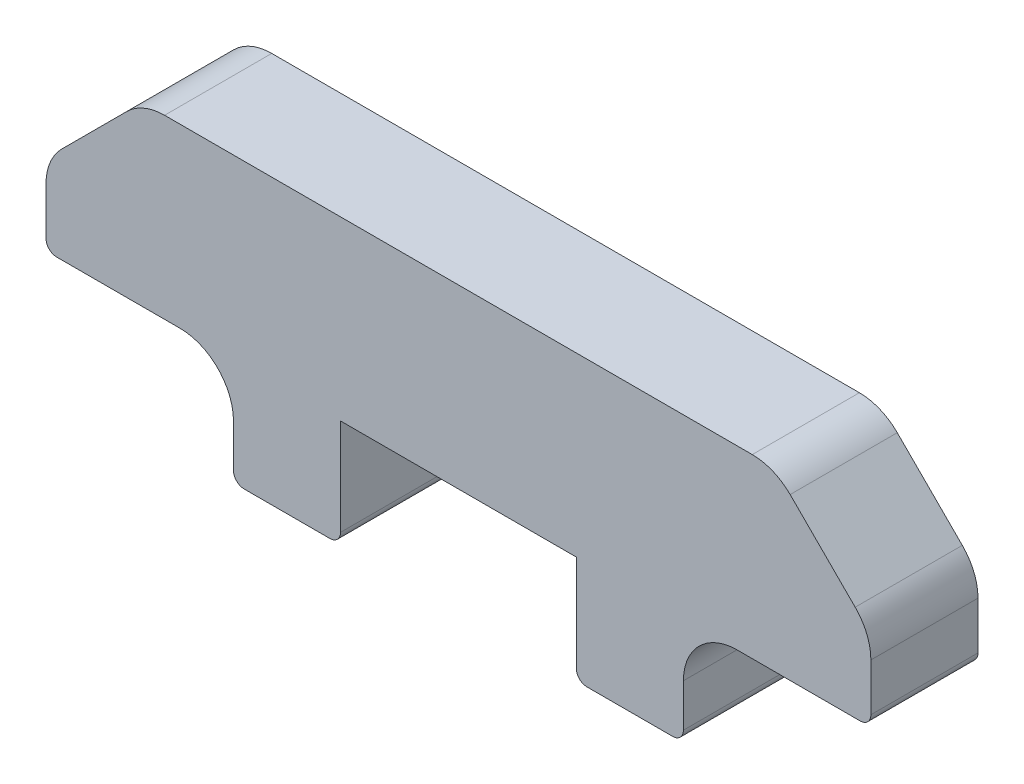
ISO-10303-21;
HEADER;
FILE_DESCRIPTION(('STEP AP214'),'2;1');
FILE_NAME('part.step','',(''),(''),'','','');
FILE_SCHEMA(('AUTOMOTIVE_DESIGN { 1 0 10303 214 1 1 1 1 }'));
ENDSEC;
DATA;
#1=APPLICATION_CONTEXT('core data for automotive mechanical design processes');
#2=APPLICATION_PROTOCOL_DEFINITION('international standard','automotive_design',2000,#1);
#3=PRODUCT_CONTEXT('',#1,'mechanical');
#4=PRODUCT('Part','Part','',(#3));
#5=PRODUCT_RELATED_PRODUCT_CATEGORY('part','',(#4));
#6=PRODUCT_DEFINITION_FORMATION('','',#4);
#7=PRODUCT_DEFINITION_CONTEXT('part definition',#1,'design');
#8=PRODUCT_DEFINITION('design','',#6,#7);
#9=PRODUCT_DEFINITION_SHAPE('','',#8);
#10=(LENGTH_UNIT() NAMED_UNIT(*) SI_UNIT(.MILLI.,.METRE.));
#11=(NAMED_UNIT(*) PLANE_ANGLE_UNIT() SI_UNIT($,.RADIAN.));
#12=(NAMED_UNIT(*) SI_UNIT($,.STERADIAN.) SOLID_ANGLE_UNIT());
#13=UNCERTAINTY_MEASURE_WITH_UNIT(LENGTH_MEASURE(1.E-05),#10,'distance_accuracy_value','');
#14=(GEOMETRIC_REPRESENTATION_CONTEXT(3) GLOBAL_UNCERTAINTY_ASSIGNED_CONTEXT((#13)) GLOBAL_UNIT_ASSIGNED_CONTEXT((#10,
#11,#12)) REPRESENTATION_CONTEXT('',''));
#15=CARTESIAN_POINT('',(0.,0.,0.));
#16=DIRECTION('',(0.,0.,1.));
#17=DIRECTION('',(1.,0.,0.));
#18=AXIS2_PLACEMENT_3D('',#15,#16,#17);
#19=CARTESIAN_POINT('',(-22.,0.,20.));
#20=DIRECTION('',(-1.,0.,0.));
#21=DIRECTION('',(0.,-1.,0.));
#22=AXIS2_PLACEMENT_3D('',#19,#20,#21);
#23=PLANE('',#22);
#24=DIRECTION('',(0.,1.,0.));
#25=VECTOR('',#24,1.);
#26=CARTESIAN_POINT('',(-22.,0.,0.));
#27=LINE('',#26,#25);
#28=CARTESIAN_POINT('',(-22.,-18.,0.));
#29=VERTEX_POINT('',#28);
#30=CARTESIAN_POINT('',(-22.,0.,0.));
#31=VERTEX_POINT('',#30);
#32=EDGE_CURVE('E254',#29,#31,#27,.T.);
#33=ORIENTED_EDGE('',*,*,#32,.T.);
#34=DIRECTION('',(0.,0.,-1.));
#35=VECTOR('',#34,1.);
#36=CARTESIAN_POINT('',(-22.,0.,20.));
#37=LINE('',#36,#35);
#38=CARTESIAN_POINT('',(-22.,0.,20.));
#39=VERTEX_POINT('',#38);
#40=EDGE_CURVE('E11',#39,#31,#37,.T.);
#41=ORIENTED_EDGE('',*,*,#40,.F.);
#42=DIRECTION('',(0.,1.,0.));
#43=VECTOR('',#42,1.);
#44=CARTESIAN_POINT('',(-22.,0.,20.));
#45=LINE('',#44,#43);
#46=CARTESIAN_POINT('',(-22.,-18.,20.));
#47=VERTEX_POINT('',#46);
#48=EDGE_CURVE('E330',#47,#39,#45,.T.);
#49=ORIENTED_EDGE('',*,*,#48,.F.);
#50=DIRECTION('',(0.,0.,-1.));
#51=VECTOR('',#50,1.);
#52=CARTESIAN_POINT('',(-22.,-18.,20.));
#53=LINE('',#52,#51);
#54=EDGE_CURVE('E250',#47,#29,#53,.T.);
#55=ORIENTED_EDGE('',*,*,#54,.T.);
#56=EDGE_LOOP('',(#33,#41,#49,#55));
#57=FACE_BOUND('',#56,.T.);
#58=ADVANCED_FACE('F45',(#57),#23,.F.);
#59=CARTESIAN_POINT('',(22.,0.,20.));
#60=DIRECTION('',(0.,1.,0.));
#61=DIRECTION('',(0.,0.,1.));
#62=AXIS2_PLACEMENT_3D('',#59,#60,#61);
#63=PLANE('',#62);
#64=DIRECTION('',(1.,0.,0.));
#65=VECTOR('',#64,1.);
#66=CARTESIAN_POINT('',(22.,0.,0.));
#67=LINE('',#66,#65);
#68=CARTESIAN_POINT('',(22.,0.,0.));
#69=VERTEX_POINT('',#68);
#70=EDGE_CURVE('E258',#31,#69,#67,.T.);
#71=ORIENTED_EDGE('',*,*,#70,.T.);
#72=DIRECTION('',(0.,0.,-1.));
#73=VECTOR('',#72,1.);
#74=CARTESIAN_POINT('',(22.,0.,20.));
#75=LINE('',#74,#73);
#76=CARTESIAN_POINT('',(22.,0.,20.));
#77=VERTEX_POINT('',#76);
#78=EDGE_CURVE('E54',#77,#69,#75,.T.);
#79=ORIENTED_EDGE('',*,*,#78,.F.);
#80=DIRECTION('',(1.,0.,0.));
#81=VECTOR('',#80,1.);
#82=CARTESIAN_POINT('',(22.,0.,20.));
#83=LINE('',#82,#81);
#84=EDGE_CURVE('E159',#39,#77,#83,.T.);
#85=ORIENTED_EDGE('',*,*,#84,.F.);
#86=ORIENTED_EDGE('',*,*,#40,.T.);
#87=EDGE_LOOP('',(#71,#79,#85,#86));
#88=FACE_BOUND('',#87,.T.);
#89=ADVANCED_FACE('F522',(#88),#63,.F.);
#90=CARTESIAN_POINT('',(22.,0.,20.));
#91=DIRECTION('',(1.,0.,0.));
#92=DIRECTION('',(0.,1.,0.));
#93=AXIS2_PLACEMENT_3D('',#90,#91,#92);
#94=PLANE('',#93);
#95=DIRECTION('',(0.,-1.,0.));
#96=VECTOR('',#95,1.);
#97=CARTESIAN_POINT('',(22.,0.,0.));
#98=LINE('',#97,#96);
#99=CARTESIAN_POINT('',(22.,-18.,0.));
#100=VERTEX_POINT('',#99);
#101=EDGE_CURVE('E261',#69,#100,#98,.T.);
#102=ORIENTED_EDGE('',*,*,#101,.T.);
#103=DIRECTION('',(0.,0.,-1.));
#104=VECTOR('',#103,1.);
#105=CARTESIAN_POINT('',(22.,-18.,20.));
#106=LINE('',#105,#104);
#107=CARTESIAN_POINT('',(22.,-18.,20.));
#108=VERTEX_POINT('',#107);
#109=EDGE_CURVE('E413',#108,#100,#106,.T.);
#110=ORIENTED_EDGE('',*,*,#109,.F.);
#111=DIRECTION('',(0.,-1.,0.));
#112=VECTOR('',#111,1.);
#113=CARTESIAN_POINT('',(22.,0.,20.));
#114=LINE('',#113,#112);
#115=EDGE_CURVE('E423',#77,#108,#114,.T.);
#116=ORIENTED_EDGE('',*,*,#115,.F.);
#117=ORIENTED_EDGE('',*,*,#78,.T.);
#118=EDGE_LOOP('',(#102,#110,#116,#117));
#119=FACE_BOUND('',#118,.T.);
#120=ADVANCED_FACE('F421',(#119),#94,.F.);
#121=CARTESIAN_POINT('',(24.,-18.,20.));
#122=DIRECTION('',(0.,0.,-1.));
#123=DIRECTION('',(-1.,0.,0.));
#124=AXIS2_PLACEMENT_3D('',#121,#122,#123);
#125=CYLINDRICAL_SURFACE('',#124,2.);
#126=CARTESIAN_POINT('',(24.,-18.,0.));
#127=DIRECTION('',(0.,0.,1.));
#128=DIRECTION('',(1.,0.,0.));
#129=AXIS2_PLACEMENT_3D('',#126,#127,#128);
#130=CIRCLE('',#129,2.);
#131=CARTESIAN_POINT('',(24.,-20.,0.));
#132=VERTEX_POINT('',#131);
#133=EDGE_CURVE('E264',#100,#132,#130,.T.);
#134=ORIENTED_EDGE('',*,*,#133,.T.);
#135=DIRECTION('',(0.,0.,-1.));
#136=VECTOR('',#135,1.);
#137=CARTESIAN_POINT('',(24.,-20.,20.));
#138=LINE('',#137,#136);
#139=CARTESIAN_POINT('',(24.,-20.,20.));
#140=VERTEX_POINT('',#139);
#141=EDGE_CURVE('E409',#140,#132,#138,.T.);
#142=ORIENTED_EDGE('',*,*,#141,.F.);
#143=CARTESIAN_POINT('',(24.,-18.,20.));
#144=DIRECTION('',(0.,0.,1.));
#145=DIRECTION('',(1.,0.,0.));
#146=AXIS2_PLACEMENT_3D('',#143,#144,#145);
#147=CIRCLE('',#146,2.);
#148=EDGE_CURVE('E442',#108,#140,#147,.T.);
#149=ORIENTED_EDGE('',*,*,#148,.F.);
#150=ORIENTED_EDGE('',*,*,#109,.T.);
#151=EDGE_LOOP('',(#134,#142,#149,#150));
#152=FACE_BOUND('',#151,.T.);
#153=ADVANCED_FACE('F432',(#152),#125,.T.);
#154=CARTESIAN_POINT('',(24.,-20.,20.));
#155=DIRECTION('',(0.,1.,0.));
#156=DIRECTION('',(-1.,0.,0.));
#157=AXIS2_PLACEMENT_3D('',#154,#155,#156);
#158=PLANE('',#157);
#159=DIRECTION('',(1.,0.,0.));
#160=VECTOR('',#159,1.);
#161=CARTESIAN_POINT('',(24.,-20.,0.));
#162=LINE('',#161,#160);
#163=CARTESIAN_POINT('',(40.,-20.,0.));
#164=VERTEX_POINT('',#163);
#165=EDGE_CURVE('E267',#132,#164,#162,.T.);
#166=ORIENTED_EDGE('',*,*,#165,.T.);
#167=DIRECTION('',(0.,0.,-1.));
#168=VECTOR('',#167,1.);
#169=CARTESIAN_POINT('',(40.,-20.,20.));
#170=LINE('',#169,#168);
#171=CARTESIAN_POINT('',(40.,-20.,20.));
#172=VERTEX_POINT('',#171);
#173=EDGE_CURVE('E405',#172,#164,#170,.T.);
#174=ORIENTED_EDGE('',*,*,#173,.F.);
#175=DIRECTION('',(1.,0.,0.));
#176=VECTOR('',#175,1.);
#177=CARTESIAN_POINT('',(24.,-20.,20.));
#178=LINE('',#177,#176);
#179=EDGE_CURVE('E438',#140,#172,#178,.T.);
#180=ORIENTED_EDGE('',*,*,#179,.F.);
#181=ORIENTED_EDGE('',*,*,#141,.T.);
#182=EDGE_LOOP('',(#166,#174,#180,#181));
#183=FACE_BOUND('',#182,.T.);
#184=ADVANCED_FACE('F436',(#183),#158,.F.);
#185=CARTESIAN_POINT('',(40.,-18.,20.));
#186=DIRECTION('',(0.,0.,-1.));
#187=DIRECTION('',(-1.,0.,0.));
#188=AXIS2_PLACEMENT_3D('',#185,#186,#187);
#189=CYLINDRICAL_SURFACE('',#188,2.);
#190=CARTESIAN_POINT('',(40.,-18.,0.));
#191=DIRECTION('',(0.,0.,1.));
#192=DIRECTION('',(1.,0.,0.));
#193=AXIS2_PLACEMENT_3D('',#190,#191,#192);
#194=CIRCLE('',#193,2.);
#195=CARTESIAN_POINT('',(42.,-18.,0.));
#196=VERTEX_POINT('',#195);
#197=EDGE_CURVE('E270',#164,#196,#194,.T.);
#198=ORIENTED_EDGE('',*,*,#197,.T.);
#199=DIRECTION('',(0.,0.,-1.));
#200=VECTOR('',#199,1.);
#201=CARTESIAN_POINT('',(42.,-18.,20.));
#202=LINE('',#201,#200);
#203=CARTESIAN_POINT('',(42.,-18.,20.));
#204=VERTEX_POINT('',#203);
#205=EDGE_CURVE('E401',#204,#196,#202,.T.);
#206=ORIENTED_EDGE('',*,*,#205,.F.);
#207=CARTESIAN_POINT('',(40.,-18.,20.));
#208=DIRECTION('',(0.,0.,1.));
#209=DIRECTION('',(1.,0.,0.));
#210=AXIS2_PLACEMENT_3D('',#207,#208,#209);
#211=CIRCLE('',#210,2.);
#212=EDGE_CURVE('E441',#172,#204,#211,.T.);
#213=ORIENTED_EDGE('',*,*,#212,.F.);
#214=ORIENTED_EDGE('',*,*,#173,.T.);
#215=EDGE_LOOP('',(#198,#206,#213,#214));
#216=FACE_BOUND('',#215,.T.);
#217=ADVANCED_FACE('F535',(#216),#189,.T.);
#218=CARTESIAN_POINT('',(42.,-18.,20.));
#219=DIRECTION('',(-1.,0.,0.));
#220=DIRECTION('',(0.,0.,1.));
#221=AXIS2_PLACEMENT_3D('',#218,#219,#220);
#222=PLANE('',#221);
#223=DIRECTION('',(0.,1.,0.));
#224=VECTOR('',#223,1.);
#225=CARTESIAN_POINT('',(42.,-18.,0.));
#226=LINE('',#225,#224);
#227=CARTESIAN_POINT('',(42.,-10.0000000000001,0.));
#228=VERTEX_POINT('',#227);
#229=EDGE_CURVE('E273',#196,#228,#226,.T.);
#230=ORIENTED_EDGE('',*,*,#229,.T.);
#231=DIRECTION('',(0.,0.,-1.));
#232=VECTOR('',#231,1.);
#233=CARTESIAN_POINT('',(42.,-10.0000000000001,20.));
#234=LINE('',#233,#232);
#235=CARTESIAN_POINT('',(42.,-10.0000000000001,20.));
#236=VERTEX_POINT('',#235);
#237=EDGE_CURVE('E397',#236,#228,#234,.T.);
#238=ORIENTED_EDGE('',*,*,#237,.F.);
#239=DIRECTION('',(0.,1.,0.));
#240=VECTOR('',#239,1.);
#241=CARTESIAN_POINT('',(42.,-18.,20.));
#242=LINE('',#241,#240);
#243=EDGE_CURVE('E446',#204,#236,#242,.T.);
#244=ORIENTED_EDGE('',*,*,#243,.F.);
#245=ORIENTED_EDGE('',*,*,#205,.T.);
#246=EDGE_LOOP('',(#230,#238,#244,#245));
#247=FACE_BOUND('',#246,.T.);
#248=ADVANCED_FACE('F538',(#247),#222,.F.);
#249=CARTESIAN_POINT('',(52.,-10.,20.));
#250=DIRECTION('',(0.,0.,-1.));
#251=DIRECTION('',(-1.,0.,0.));
#252=AXIS2_PLACEMENT_3D('',#249,#250,#251);
#253=CYLINDRICAL_SURFACE('',#252,10.);
#254=CARTESIAN_POINT('',(52.,-10.,0.));
#255=DIRECTION('',(0.,0.,-1.));
#256=DIRECTION('',(-1.,0.,0.));
#257=AXIS2_PLACEMENT_3D('',#254,#255,#256);
#258=CIRCLE('',#257,10.);
#259=CARTESIAN_POINT('',(52.0000000000001,0.,0.));
#260=VERTEX_POINT('',#259);
#261=EDGE_CURVE('E276',#228,#260,#258,.T.);
#262=ORIENTED_EDGE('',*,*,#261,.T.);
#263=DIRECTION('',(0.,0.,-1.));
#264=VECTOR('',#263,1.);
#265=CARTESIAN_POINT('',(52.0000000000001,0.,20.));
#266=LINE('',#265,#264);
#267=CARTESIAN_POINT('',(52.0000000000001,0.,20.));
#268=VERTEX_POINT('',#267);
#269=EDGE_CURVE('E393',#268,#260,#266,.T.);
#270=ORIENTED_EDGE('',*,*,#269,.F.);
#271=CARTESIAN_POINT('',(52.,-10.,20.));
#272=DIRECTION('',(0.,0.,-1.));
#273=DIRECTION('',(-1.,0.,0.));
#274=AXIS2_PLACEMENT_3D('',#271,#272,#273);
#275=CIRCLE('',#274,10.);
#276=EDGE_CURVE('E453',#236,#268,#275,.T.);
#277=ORIENTED_EDGE('',*,*,#276,.F.);
#278=ORIENTED_EDGE('',*,*,#237,.T.);
#279=EDGE_LOOP('',(#262,#270,#277,#278));
#280=FACE_BOUND('',#279,.T.);
#281=ADVANCED_FACE('F542',(#280),#253,.F.);
#282=CARTESIAN_POINT('',(52.0000000000001,0.,20.));
#283=DIRECTION('',(0.,1.,0.));
#284=DIRECTION('',(-1.,0.,0.));
#285=AXIS2_PLACEMENT_3D('',#282,#283,#284);
#286=PLANE('',#285);
#287=DIRECTION('',(1.,0.,0.));
#288=VECTOR('',#287,1.);
#289=CARTESIAN_POINT('',(52.0000000000001,0.,0.));
#290=LINE('',#289,#288);
#291=CARTESIAN_POINT('',(75.,0.,0.));
#292=VERTEX_POINT('',#291);
#293=EDGE_CURVE('E279',#260,#292,#290,.T.);
#294=ORIENTED_EDGE('',*,*,#293,.T.);
#295=DIRECTION('',(0.,0.,-1.));
#296=VECTOR('',#295,1.);
#297=CARTESIAN_POINT('',(75.,0.,20.));
#298=LINE('',#297,#296);
#299=CARTESIAN_POINT('',(75.,0.,20.));
#300=VERTEX_POINT('',#299);
#301=EDGE_CURVE('E389',#300,#292,#298,.T.);
#302=ORIENTED_EDGE('',*,*,#301,.F.);
#303=DIRECTION('',(1.,0.,0.));
#304=VECTOR('',#303,1.);
#305=CARTESIAN_POINT('',(52.0000000000001,0.,20.));
#306=LINE('',#305,#304);
#307=EDGE_CURVE('E456',#268,#300,#306,.T.);
#308=ORIENTED_EDGE('',*,*,#307,.F.);
#309=ORIENTED_EDGE('',*,*,#269,.T.);
#310=EDGE_LOOP('',(#294,#302,#308,#309));
#311=FACE_BOUND('',#310,.T.);
#312=ADVANCED_FACE('F546',(#311),#286,.F.);
#313=CARTESIAN_POINT('',(75.,2.,20.));
#314=DIRECTION('',(0.,0.,-1.));
#315=DIRECTION('',(-1.,0.,0.));
#316=AXIS2_PLACEMENT_3D('',#313,#314,#315);
#317=CYLINDRICAL_SURFACE('',#316,2.);
#318=CARTESIAN_POINT('',(75.,2.,0.));
#319=DIRECTION('',(0.,0.,1.));
#320=DIRECTION('',(1.,0.,0.));
#321=AXIS2_PLACEMENT_3D('',#318,#319,#320);
#322=CIRCLE('',#321,2.);
#323=CARTESIAN_POINT('',(77.,2.,0.));
#324=VERTEX_POINT('',#323);
#325=EDGE_CURVE('E282',#292,#324,#322,.T.);
#326=ORIENTED_EDGE('',*,*,#325,.T.);
#327=DIRECTION('',(0.,0.,-1.));
#328=VECTOR('',#327,1.);
#329=CARTESIAN_POINT('',(77.,2.,20.));
#330=LINE('',#329,#328);
#331=CARTESIAN_POINT('',(77.,2.,20.));
#332=VERTEX_POINT('',#331);
#333=EDGE_CURVE('E385',#332,#324,#330,.T.);
#334=ORIENTED_EDGE('',*,*,#333,.F.);
#335=CARTESIAN_POINT('',(75.,2.,20.));
#336=DIRECTION('',(0.,0.,1.));
#337=DIRECTION('',(1.,0.,0.));
#338=AXIS2_PLACEMENT_3D('',#335,#336,#337);
#339=CIRCLE('',#338,2.);
#340=EDGE_CURVE('E459',#300,#332,#339,.T.);
#341=ORIENTED_EDGE('',*,*,#340,.F.);
#342=ORIENTED_EDGE('',*,*,#301,.T.);
#343=EDGE_LOOP('',(#326,#334,#341,#342));
#344=FACE_BOUND('',#343,.T.);
#345=ADVANCED_FACE('F550',(#344),#317,.T.);
#346=CARTESIAN_POINT('',(77.,2.00000000000002,20.));
#347=DIRECTION('',(-1.,0.,0.));
#348=DIRECTION('',(0.,0.,1.));
#349=AXIS2_PLACEMENT_3D('',#346,#347,#348);
#350=PLANE('',#349);
#351=DIRECTION('',(0.,1.,0.));
#352=VECTOR('',#351,1.);
#353=CARTESIAN_POINT('',(77.,2.00000000000002,0.));
#354=LINE('',#353,#352);
#355=CARTESIAN_POINT('',(77.,10.857864376269,0.));
#356=VERTEX_POINT('',#355);
#357=EDGE_CURVE('E285',#324,#356,#354,.T.);
#358=ORIENTED_EDGE('',*,*,#357,.T.);
#359=DIRECTION('',(0.,0.,-1.));
#360=VECTOR('',#359,1.);
#361=CARTESIAN_POINT('',(77.,10.857864376269,20.));
#362=LINE('',#361,#360);
#363=CARTESIAN_POINT('',(77.,10.857864376269,20.));
#364=VERTEX_POINT('',#363);
#365=EDGE_CURVE('E381',#364,#356,#362,.T.);
#366=ORIENTED_EDGE('',*,*,#365,.F.);
#367=DIRECTION('',(0.,1.,0.));
#368=VECTOR('',#367,1.);
#369=CARTESIAN_POINT('',(77.,2.00000000000002,20.));
#370=LINE('',#369,#368);
#371=EDGE_CURVE('E462',#332,#364,#370,.T.);
#372=ORIENTED_EDGE('',*,*,#371,.F.);
#373=ORIENTED_EDGE('',*,*,#333,.T.);
#374=EDGE_LOOP('',(#358,#366,#372,#373));
#375=FACE_BOUND('',#374,.T.);
#376=ADVANCED_FACE('F554',(#375),#350,.F.);
#377=CARTESIAN_POINT('',(67.,10.8578643762691,20.));
#378=DIRECTION('',(0.,0.,-1.));
#379=DIRECTION('',(-1.,0.,0.));
#380=AXIS2_PLACEMENT_3D('',#377,#378,#379);
#381=CYLINDRICAL_SURFACE('',#380,9.99999999999999);
#382=CARTESIAN_POINT('',(67.,10.8578643762691,0.));
#383=DIRECTION('',(0.,0.,1.));
#384=DIRECTION('',(1.,0.,0.));
#385=AXIS2_PLACEMENT_3D('',#382,#383,#384);
#386=CIRCLE('',#385,9.99999999999999);
#387=CARTESIAN_POINT('',(74.0710678118654,17.9289321881346,0.));
#388=VERTEX_POINT('',#387);
#389=EDGE_CURVE('E288',#356,#388,#386,.T.);
#390=ORIENTED_EDGE('',*,*,#389,.T.);
#391=DIRECTION('',(0.,0.,-1.));
#392=VECTOR('',#391,1.);
#393=CARTESIAN_POINT('',(74.0710678118654,17.9289321881346,20.));
#394=LINE('',#393,#392);
#395=CARTESIAN_POINT('',(74.0710678118654,17.9289321881346,20.));
#396=VERTEX_POINT('',#395);
#397=EDGE_CURVE('E377',#396,#388,#394,.T.);
#398=ORIENTED_EDGE('',*,*,#397,.F.);
#399=CARTESIAN_POINT('',(67.,10.8578643762691,20.));
#400=DIRECTION('',(0.,0.,1.));
#401=DIRECTION('',(1.,0.,0.));
#402=AXIS2_PLACEMENT_3D('',#399,#400,#401);
#403=CIRCLE('',#402,9.99999999999999);
#404=EDGE_CURVE('E465',#364,#396,#403,.T.);
#405=ORIENTED_EDGE('',*,*,#404,.F.);
#406=ORIENTED_EDGE('',*,*,#365,.T.);
#407=EDGE_LOOP('',(#390,#398,#405,#406));
#408=FACE_BOUND('',#407,.T.);
#409=ADVANCED_FACE('F558',(#408),#381,.T.);
#410=CARTESIAN_POINT('',(74.0710678118654,17.9289321881346,20.));
#411=DIRECTION('',(-0.707106781186547,-0.707106781186548,0.));
#412=DIRECTION('',(0.707106781186548,-0.707106781186547,0.));
#413=AXIS2_PLACEMENT_3D('',#410,#411,#412);
#414=PLANE('',#413);
#415=DIRECTION('',(-0.707106781186548,0.707106781186547,0.));
#416=VECTOR('',#415,1.);
#417=CARTESIAN_POINT('',(74.0710678118654,17.9289321881346,0.));
#418=LINE('',#417,#416);
#419=CARTESIAN_POINT('',(61.9289321881345,30.0710678118654,0.));
#420=VERTEX_POINT('',#419);
#421=EDGE_CURVE('E291',#388,#420,#418,.T.);
#422=ORIENTED_EDGE('',*,*,#421,.T.);
#423=DIRECTION('',(0.,0.,-1.));
#424=VECTOR('',#423,1.);
#425=CARTESIAN_POINT('',(61.9289321881345,30.0710678118654,20.));
#426=LINE('',#425,#424);
#427=CARTESIAN_POINT('',(61.9289321881345,30.0710678118654,20.));
#428=VERTEX_POINT('',#427);
#429=EDGE_CURVE('E373',#428,#420,#426,.T.);
#430=ORIENTED_EDGE('',*,*,#429,.F.);
#431=DIRECTION('',(-0.707106781186548,0.707106781186547,0.));
#432=VECTOR('',#431,1.);
#433=CARTESIAN_POINT('',(74.0710678118654,17.9289321881346,20.));
#434=LINE('',#433,#432);
#435=EDGE_CURVE('E468',#396,#428,#434,.T.);
#436=ORIENTED_EDGE('',*,*,#435,.F.);
#437=ORIENTED_EDGE('',*,*,#397,.T.);
#438=EDGE_LOOP('',(#422,#430,#436,#437));
#439=FACE_BOUND('',#438,.T.);
#440=ADVANCED_FACE('F562',(#439),#414,.F.);
#441=CARTESIAN_POINT('',(54.857864376269,23.,20.));
#442=DIRECTION('',(0.,0.,-1.));
#443=DIRECTION('',(-1.,0.,0.));
#444=AXIS2_PLACEMENT_3D('',#441,#442,#443);
#445=CYLINDRICAL_SURFACE('',#444,10.);
#446=CARTESIAN_POINT('',(54.857864376269,23.,0.));
#447=DIRECTION('',(0.,0.,1.));
#448=DIRECTION('',(1.,0.,0.));
#449=AXIS2_PLACEMENT_3D('',#446,#447,#448);
#450=CIRCLE('',#449,10.);
#451=CARTESIAN_POINT('',(54.857864376269,33.,0.));
#452=VERTEX_POINT('',#451);
#453=EDGE_CURVE('E294',#420,#452,#450,.T.);
#454=ORIENTED_EDGE('',*,*,#453,.T.);
#455=DIRECTION('',(0.,0.,-1.));
#456=VECTOR('',#455,1.);
#457=CARTESIAN_POINT('',(54.857864376269,33.,20.));
#458=LINE('',#457,#456);
#459=CARTESIAN_POINT('',(54.857864376269,33.,20.));
#460=VERTEX_POINT('',#459);
#461=EDGE_CURVE('E369',#460,#452,#458,.T.);
#462=ORIENTED_EDGE('',*,*,#461,.F.);
#463=CARTESIAN_POINT('',(54.857864376269,23.,20.));
#464=DIRECTION('',(0.,0.,1.));
#465=DIRECTION('',(1.,0.,0.));
#466=AXIS2_PLACEMENT_3D('',#463,#464,#465);
#467=CIRCLE('',#466,10.);
#468=EDGE_CURVE('E471',#428,#460,#467,.T.);
#469=ORIENTED_EDGE('',*,*,#468,.F.);
#470=ORIENTED_EDGE('',*,*,#429,.T.);
#471=EDGE_LOOP('',(#454,#462,#469,#470));
#472=FACE_BOUND('',#471,.T.);
#473=ADVANCED_FACE('F566',(#472),#445,.T.);
#474=CARTESIAN_POINT('',(-54.857864376269,33.,20.));
#475=DIRECTION('',(0.,-1.,0.));
#476=DIRECTION('',(1.,0.,0.));
#477=AXIS2_PLACEMENT_3D('',#474,#475,#476);
#478=PLANE('',#477);
#479=DIRECTION('',(-1.,0.,0.));
#480=VECTOR('',#479,1.);
#481=CARTESIAN_POINT('',(-54.857864376269,33.,0.));
#482=LINE('',#481,#480);
#483=CARTESIAN_POINT('',(-54.857864376269,33.,0.));
#484=VERTEX_POINT('',#483);
#485=EDGE_CURVE('E297',#452,#484,#482,.T.);
#486=ORIENTED_EDGE('',*,*,#485,.T.);
#487=DIRECTION('',(0.,0.,-1.));
#488=VECTOR('',#487,1.);
#489=CARTESIAN_POINT('',(-54.857864376269,33.,20.));
#490=LINE('',#489,#488);
#491=CARTESIAN_POINT('',(-54.857864376269,33.,20.));
#492=VERTEX_POINT('',#491);
#493=EDGE_CURVE('E365',#492,#484,#490,.T.);
#494=ORIENTED_EDGE('',*,*,#493,.F.);
#495=DIRECTION('',(-1.,0.,0.));
#496=VECTOR('',#495,1.);
#497=CARTESIAN_POINT('',(-54.857864376269,33.,20.));
#498=LINE('',#497,#496);
#499=EDGE_CURVE('E474',#460,#492,#498,.T.);
#500=ORIENTED_EDGE('',*,*,#499,.F.);
#501=ORIENTED_EDGE('',*,*,#461,.T.);
#502=EDGE_LOOP('',(#486,#494,#500,#501));
#503=FACE_BOUND('',#502,.T.);
#504=ADVANCED_FACE('F570',(#503),#478,.F.);
#505=CARTESIAN_POINT('',(-54.857864376269,23.,20.));
#506=DIRECTION('',(0.,0.,-1.));
#507=DIRECTION('',(-1.,0.,0.));
#508=AXIS2_PLACEMENT_3D('',#505,#506,#507);
#509=CYLINDRICAL_SURFACE('',#508,10.);
#510=CARTESIAN_POINT('',(-54.857864376269,23.,0.));
#511=DIRECTION('',(0.,0.,1.));
#512=DIRECTION('',(-1.,0.,0.));
#513=AXIS2_PLACEMENT_3D('',#510,#511,#512);
#514=CIRCLE('',#513,10.);
#515=CARTESIAN_POINT('',(-61.9289321881345,30.0710678118654,0.));
#516=VERTEX_POINT('',#515);
#517=EDGE_CURVE('E300',#484,#516,#514,.T.);
#518=ORIENTED_EDGE('',*,*,#517,.T.);
#519=DIRECTION('',(0.,0.,-1.));
#520=VECTOR('',#519,1.);
#521=CARTESIAN_POINT('',(-61.9289321881345,30.0710678118654,20.));
#522=LINE('',#521,#520);
#523=CARTESIAN_POINT('',(-61.9289321881345,30.0710678118654,20.));
#524=VERTEX_POINT('',#523);
#525=EDGE_CURVE('E361',#524,#516,#522,.T.);
#526=ORIENTED_EDGE('',*,*,#525,.F.);
#527=CARTESIAN_POINT('',(-54.857864376269,23.,20.));
#528=DIRECTION('',(0.,0.,1.));
#529=DIRECTION('',(-1.,0.,0.));
#530=AXIS2_PLACEMENT_3D('',#527,#528,#529);
#531=CIRCLE('',#530,10.);
#532=EDGE_CURVE('E477',#492,#524,#531,.T.);
#533=ORIENTED_EDGE('',*,*,#532,.F.);
#534=ORIENTED_EDGE('',*,*,#493,.T.);
#535=EDGE_LOOP('',(#518,#526,#533,#534));
#536=FACE_BOUND('',#535,.T.);
#537=ADVANCED_FACE('F574',(#536),#509,.T.);
#538=CARTESIAN_POINT('',(-74.0710678118654,17.9289321881346,20.));
#539=DIRECTION('',(0.707106781186547,-0.707106781186548,0.));
#540=DIRECTION('',(0.707106781186548,0.707106781186547,0.));
#541=AXIS2_PLACEMENT_3D('',#538,#539,#540);
#542=PLANE('',#541);
#543=DIRECTION('',(-0.707106781186548,-0.707106781186547,0.));
#544=VECTOR('',#543,1.);
#545=CARTESIAN_POINT('',(-74.0710678118654,17.9289321881346,0.));
#546=LINE('',#545,#544);
#547=CARTESIAN_POINT('',(-74.0710678118654,17.9289321881346,0.));
#548=VERTEX_POINT('',#547);
#549=EDGE_CURVE('E303',#516,#548,#546,.T.);
#550=ORIENTED_EDGE('',*,*,#549,.T.);
#551=DIRECTION('',(0.,0.,-1.));
#552=VECTOR('',#551,1.);
#553=CARTESIAN_POINT('',(-74.0710678118654,17.9289321881346,20.));
#554=LINE('',#553,#552);
#555=CARTESIAN_POINT('',(-74.0710678118654,17.9289321881346,20.));
#556=VERTEX_POINT('',#555);
#557=EDGE_CURVE('E357',#556,#548,#554,.T.);
#558=ORIENTED_EDGE('',*,*,#557,.F.);
#559=DIRECTION('',(-0.707106781186548,-0.707106781186547,0.));
#560=VECTOR('',#559,1.);
#561=CARTESIAN_POINT('',(-74.0710678118654,17.9289321881346,20.));
#562=LINE('',#561,#560);
#563=EDGE_CURVE('E480',#524,#556,#562,.T.);
#564=ORIENTED_EDGE('',*,*,#563,.F.);
#565=ORIENTED_EDGE('',*,*,#525,.T.);
#566=EDGE_LOOP('',(#550,#558,#564,#565));
#567=FACE_BOUND('',#566,.T.);
#568=ADVANCED_FACE('F578',(#567),#542,.F.);
#569=CARTESIAN_POINT('',(-67.,10.857864376269,20.));
#570=DIRECTION('',(0.,0.,-1.));
#571=DIRECTION('',(-1.,0.,0.));
#572=AXIS2_PLACEMENT_3D('',#569,#570,#571);
#573=CYLINDRICAL_SURFACE('',#572,9.99999999999999);
#574=CARTESIAN_POINT('',(-67.,10.857864376269,0.));
#575=DIRECTION('',(0.,0.,1.));
#576=DIRECTION('',(-1.,0.,0.));
#577=AXIS2_PLACEMENT_3D('',#574,#575,#576);
#578=CIRCLE('',#577,9.99999999999999);
#579=CARTESIAN_POINT('',(-77.,10.857864376269,0.));
#580=VERTEX_POINT('',#579);
#581=EDGE_CURVE('E306',#548,#580,#578,.T.);
#582=ORIENTED_EDGE('',*,*,#581,.T.);
#583=DIRECTION('',(0.,0.,-1.));
#584=VECTOR('',#583,1.);
#585=CARTESIAN_POINT('',(-77.,10.857864376269,20.));
#586=LINE('',#585,#584);
#587=CARTESIAN_POINT('',(-77.,10.857864376269,20.));
#588=VERTEX_POINT('',#587);
#589=EDGE_CURVE('E353',#588,#580,#586,.T.);
#590=ORIENTED_EDGE('',*,*,#589,.F.);
#591=CARTESIAN_POINT('',(-67.,10.857864376269,20.));
#592=DIRECTION('',(0.,0.,1.));
#593=DIRECTION('',(-1.,0.,0.));
#594=AXIS2_PLACEMENT_3D('',#591,#592,#593);
#595=CIRCLE('',#594,9.99999999999999);
#596=EDGE_CURVE('E483',#556,#588,#595,.T.);
#597=ORIENTED_EDGE('',*,*,#596,.F.);
#598=ORIENTED_EDGE('',*,*,#557,.T.);
#599=EDGE_LOOP('',(#582,#590,#597,#598));
#600=FACE_BOUND('',#599,.T.);
#601=ADVANCED_FACE('F582',(#600),#573,.T.);
#602=CARTESIAN_POINT('',(-77.,2.00000000000001,20.));
#603=DIRECTION('',(1.,0.,0.));
#604=DIRECTION('',(0.,0.,-1.));
#605=AXIS2_PLACEMENT_3D('',#602,#603,#604);
#606=PLANE('',#605);
#607=DIRECTION('',(0.,-1.,0.));
#608=VECTOR('',#607,1.);
#609=CARTESIAN_POINT('',(-77.,2.00000000000001,0.));
#610=LINE('',#609,#608);
#611=CARTESIAN_POINT('',(-77.,2.00000000000001,0.));
#612=VERTEX_POINT('',#611);
#613=EDGE_CURVE('E309',#580,#612,#610,.T.);
#614=ORIENTED_EDGE('',*,*,#613,.T.);
#615=DIRECTION('',(0.,0.,-1.));
#616=VECTOR('',#615,1.);
#617=CARTESIAN_POINT('',(-77.,2.00000000000001,20.));
#618=LINE('',#617,#616);
#619=CARTESIAN_POINT('',(-77.,2.00000000000001,20.));
#620=VERTEX_POINT('',#619);
#621=EDGE_CURVE('E349',#620,#612,#618,.T.);
#622=ORIENTED_EDGE('',*,*,#621,.F.);
#623=DIRECTION('',(0.,-1.,0.));
#624=VECTOR('',#623,1.);
#625=CARTESIAN_POINT('',(-77.,2.00000000000001,20.));
#626=LINE('',#625,#624);
#627=EDGE_CURVE('E486',#588,#620,#626,.T.);
#628=ORIENTED_EDGE('',*,*,#627,.F.);
#629=ORIENTED_EDGE('',*,*,#589,.T.);
#630=EDGE_LOOP('',(#614,#622,#628,#629));
#631=FACE_BOUND('',#630,.T.);
#632=ADVANCED_FACE('F586',(#631),#606,.F.);
#633=CARTESIAN_POINT('',(-75.,2.,20.));
#634=DIRECTION('',(0.,0.,-1.));
#635=DIRECTION('',(-1.,0.,0.));
#636=AXIS2_PLACEMENT_3D('',#633,#634,#635);
#637=CYLINDRICAL_SURFACE('',#636,2.);
#638=CARTESIAN_POINT('',(-75.,2.,0.));
#639=DIRECTION('',(0.,0.,1.));
#640=DIRECTION('',(-1.,0.,0.));
#641=AXIS2_PLACEMENT_3D('',#638,#639,#640);
#642=CIRCLE('',#641,2.);
#643=CARTESIAN_POINT('',(-75.,0.,0.));
#644=VERTEX_POINT('',#643);
#645=EDGE_CURVE('E312',#612,#644,#642,.T.);
#646=ORIENTED_EDGE('',*,*,#645,.T.);
#647=DIRECTION('',(0.,0.,-1.));
#648=VECTOR('',#647,1.);
#649=CARTESIAN_POINT('',(-75.,0.,20.));
#650=LINE('',#649,#648);
#651=CARTESIAN_POINT('',(-75.,0.,20.));
#652=VERTEX_POINT('',#651);
#653=EDGE_CURVE('E345',#652,#644,#650,.T.);
#654=ORIENTED_EDGE('',*,*,#653,.F.);
#655=CARTESIAN_POINT('',(-75.,2.,20.));
#656=DIRECTION('',(0.,0.,1.));
#657=DIRECTION('',(-1.,0.,0.));
#658=AXIS2_PLACEMENT_3D('',#655,#656,#657);
#659=CIRCLE('',#658,2.);
#660=EDGE_CURVE('E489',#620,#652,#659,.T.);
#661=ORIENTED_EDGE('',*,*,#660,.F.);
#662=ORIENTED_EDGE('',*,*,#621,.T.);
#663=EDGE_LOOP('',(#646,#654,#661,#662));
#664=FACE_BOUND('',#663,.T.);
#665=ADVANCED_FACE('F590',(#664),#637,.T.);
#666=CARTESIAN_POINT('',(-52.0000000000001,0.,20.));
#667=DIRECTION('',(0.,1.,0.));
#668=DIRECTION('',(-1.,0.,0.));
#669=AXIS2_PLACEMENT_3D('',#666,#667,#668);
#670=PLANE('',#669);
#671=DIRECTION('',(1.,0.,0.));
#672=VECTOR('',#671,1.);
#673=CARTESIAN_POINT('',(-52.0000000000001,0.,0.));
#674=LINE('',#673,#672);
#675=CARTESIAN_POINT('',(-52.0000000000001,0.,0.));
#676=VERTEX_POINT('',#675);
#677=EDGE_CURVE('E315',#644,#676,#674,.T.);
#678=ORIENTED_EDGE('',*,*,#677,.T.);
#679=DIRECTION('',(0.,0.,-1.));
#680=VECTOR('',#679,1.);
#681=CARTESIAN_POINT('',(-52.0000000000001,0.,20.));
#682=LINE('',#681,#680);
#683=CARTESIAN_POINT('',(-52.0000000000001,0.,20.));
#684=VERTEX_POINT('',#683);
#685=EDGE_CURVE('E341',#684,#676,#682,.T.);
#686=ORIENTED_EDGE('',*,*,#685,.F.);
#687=DIRECTION('',(1.,0.,0.));
#688=VECTOR('',#687,1.);
#689=CARTESIAN_POINT('',(-52.0000000000001,0.,20.));
#690=LINE('',#689,#688);
#691=EDGE_CURVE('E492',#652,#684,#690,.T.);
#692=ORIENTED_EDGE('',*,*,#691,.F.);
#693=ORIENTED_EDGE('',*,*,#653,.T.);
#694=EDGE_LOOP('',(#678,#686,#692,#693));
#695=FACE_BOUND('',#694,.T.);
#696=ADVANCED_FACE('F594',(#695),#670,.F.);
#697=CARTESIAN_POINT('',(-52.,-10.,20.));
#698=DIRECTION('',(0.,0.,-1.));
#699=DIRECTION('',(-1.,0.,0.));
#700=AXIS2_PLACEMENT_3D('',#697,#698,#699);
#701=CYLINDRICAL_SURFACE('',#700,10.);
#702=CARTESIAN_POINT('',(-52.,-10.,0.));
#703=DIRECTION('',(0.,0.,-1.));
#704=DIRECTION('',(1.,0.,0.));
#705=AXIS2_PLACEMENT_3D('',#702,#703,#704);
#706=CIRCLE('',#705,10.);
#707=CARTESIAN_POINT('',(-42.,-10.0000000000001,0.));
#708=VERTEX_POINT('',#707);
#709=EDGE_CURVE('E318',#676,#708,#706,.T.);
#710=ORIENTED_EDGE('',*,*,#709,.T.);
#711=DIRECTION('',(0.,0.,-1.));
#712=VECTOR('',#711,1.);
#713=CARTESIAN_POINT('',(-42.,-10.0000000000001,20.));
#714=LINE('',#713,#712);
#715=CARTESIAN_POINT('',(-42.,-10.0000000000001,20.));
#716=VERTEX_POINT('',#715);
#717=EDGE_CURVE('E337',#716,#708,#714,.T.);
#718=ORIENTED_EDGE('',*,*,#717,.F.);
#719=CARTESIAN_POINT('',(-52.,-10.,20.));
#720=DIRECTION('',(0.,0.,-1.));
#721=DIRECTION('',(1.,0.,0.));
#722=AXIS2_PLACEMENT_3D('',#719,#720,#721);
#723=CIRCLE('',#722,10.);
#724=EDGE_CURVE('E495',#684,#716,#723,.T.);
#725=ORIENTED_EDGE('',*,*,#724,.F.);
#726=ORIENTED_EDGE('',*,*,#685,.T.);
#727=EDGE_LOOP('',(#710,#718,#725,#726));
#728=FACE_BOUND('',#727,.T.);
#729=ADVANCED_FACE('F503',(#728),#701,.F.);
#730=CARTESIAN_POINT('',(-42.,-18.,20.));
#731=DIRECTION('',(1.,0.,0.));
#732=DIRECTION('',(0.,0.,-1.));
#733=AXIS2_PLACEMENT_3D('',#730,#731,#732);
#734=PLANE('',#733);
#735=DIRECTION('',(0.,-1.,0.));
#736=VECTOR('',#735,1.);
#737=CARTESIAN_POINT('',(-42.,-18.,0.));
#738=LINE('',#737,#736);
#739=CARTESIAN_POINT('',(-42.,-18.,0.));
#740=VERTEX_POINT('',#739);
#741=EDGE_CURVE('E321',#708,#740,#738,.T.);
#742=ORIENTED_EDGE('',*,*,#741,.T.);
#743=DIRECTION('',(0.,0.,-1.));
#744=VECTOR('',#743,1.);
#745=CARTESIAN_POINT('',(-42.,-18.,20.));
#746=LINE('',#745,#744);
#747=CARTESIAN_POINT('',(-42.,-18.,20.));
#748=VERTEX_POINT('',#747);
#749=EDGE_CURVE('E243',#748,#740,#746,.T.);
#750=ORIENTED_EDGE('',*,*,#749,.F.);
#751=DIRECTION('',(0.,-1.,0.));
#752=VECTOR('',#751,1.);
#753=CARTESIAN_POINT('',(-42.,-18.,20.));
#754=LINE('',#753,#752);
#755=EDGE_CURVE('E232',#716,#748,#754,.T.);
#756=ORIENTED_EDGE('',*,*,#755,.F.);
#757=ORIENTED_EDGE('',*,*,#717,.T.);
#758=EDGE_LOOP('',(#742,#750,#756,#757));
#759=FACE_BOUND('',#758,.T.);
#760=ADVANCED_FACE('F507',(#759),#734,.F.);
#761=CARTESIAN_POINT('',(-40.,-18.,20.));
#762=DIRECTION('',(0.,0.,-1.));
#763=DIRECTION('',(-1.,0.,0.));
#764=AXIS2_PLACEMENT_3D('',#761,#762,#763);
#765=CYLINDRICAL_SURFACE('',#764,2.);
#766=CARTESIAN_POINT('',(-40.,-18.,0.));
#767=DIRECTION('',(0.,0.,1.));
#768=DIRECTION('',(-1.,0.,0.));
#769=AXIS2_PLACEMENT_3D('',#766,#767,#768);
#770=CIRCLE('',#769,2.);
#771=CARTESIAN_POINT('',(-40.,-20.,0.));
#772=VERTEX_POINT('',#771);
#773=EDGE_CURVE('E241',#740,#772,#770,.T.);
#774=ORIENTED_EDGE('',*,*,#773,.T.);
#775=DIRECTION('',(0.,0.,-1.));
#776=VECTOR('',#775,1.);
#777=CARTESIAN_POINT('',(-40.,-20.,20.));
#778=LINE('',#777,#776);
#779=CARTESIAN_POINT('',(-40.,-20.,20.));
#780=VERTEX_POINT('',#779);
#781=EDGE_CURVE('E238',#780,#772,#778,.T.);
#782=ORIENTED_EDGE('',*,*,#781,.F.);
#783=CARTESIAN_POINT('',(-40.,-18.,20.));
#784=DIRECTION('',(0.,0.,1.));
#785=DIRECTION('',(-1.,0.,0.));
#786=AXIS2_PLACEMENT_3D('',#783,#784,#785);
#787=CIRCLE('',#786,2.);
#788=EDGE_CURVE('E226',#748,#780,#787,.T.);
#789=ORIENTED_EDGE('',*,*,#788,.F.);
#790=ORIENTED_EDGE('',*,*,#749,.T.);
#791=EDGE_LOOP('',(#774,#782,#789,#790));
#792=FACE_BOUND('',#791,.T.);
#793=ADVANCED_FACE('F239',(#792),#765,.T.);
#794=CARTESIAN_POINT('',(-24.,-20.,20.));
#795=DIRECTION('',(0.,1.,0.));
#796=DIRECTION('',(-1.,0.,0.));
#797=AXIS2_PLACEMENT_3D('',#794,#795,#796);
#798=PLANE('',#797);
#799=DIRECTION('',(1.,0.,0.));
#800=VECTOR('',#799,1.);
#801=CARTESIAN_POINT('',(-24.,-20.,0.));
#802=LINE('',#801,#800);
#803=CARTESIAN_POINT('',(-24.,-20.,0.));
#804=VERTEX_POINT('',#803);
#805=EDGE_CURVE('E145',#772,#804,#802,.T.);
#806=ORIENTED_EDGE('',*,*,#805,.T.);
#807=DIRECTION('',(0.,0.,-1.));
#808=VECTOR('',#807,1.);
#809=CARTESIAN_POINT('',(-24.,-20.,20.));
#810=LINE('',#809,#808);
#811=CARTESIAN_POINT('',(-24.,-20.,20.));
#812=VERTEX_POINT('',#811);
#813=EDGE_CURVE('E244',#812,#804,#810,.T.);
#814=ORIENTED_EDGE('',*,*,#813,.F.);
#815=DIRECTION('',(1.,0.,0.));
#816=VECTOR('',#815,1.);
#817=CARTESIAN_POINT('',(-24.,-20.,20.));
#818=LINE('',#817,#816);
#819=EDGE_CURVE('E230',#780,#812,#818,.T.);
#820=ORIENTED_EDGE('',*,*,#819,.F.);
#821=ORIENTED_EDGE('',*,*,#781,.T.);
#822=EDGE_LOOP('',(#806,#814,#820,#821));
#823=FACE_BOUND('',#822,.T.);
#824=ADVANCED_FACE('F246',(#823),#798,.F.);
#825=CARTESIAN_POINT('',(-24.,-18.,20.));
#826=DIRECTION('',(0.,0.,-1.));
#827=DIRECTION('',(-1.,0.,0.));
#828=AXIS2_PLACEMENT_3D('',#825,#826,#827);
#829=CYLINDRICAL_SURFACE('',#828,2.);
#830=CARTESIAN_POINT('',(-24.,-18.,0.));
#831=DIRECTION('',(0.,0.,1.));
#832=DIRECTION('',(-1.,0.,0.));
#833=AXIS2_PLACEMENT_3D('',#830,#831,#832);
#834=CIRCLE('',#833,2.);
#835=EDGE_CURVE('E151',#804,#29,#834,.T.);
#836=ORIENTED_EDGE('',*,*,#835,.T.);
#837=ORIENTED_EDGE('',*,*,#54,.F.);
#838=CARTESIAN_POINT('',(-24.,-18.,20.));
#839=DIRECTION('',(0.,0.,1.));
#840=DIRECTION('',(-1.,0.,0.));
#841=AXIS2_PLACEMENT_3D('',#838,#839,#840);
#842=CIRCLE('',#841,2.);
#843=EDGE_CURVE('E62',#812,#47,#842,.T.);
#844=ORIENTED_EDGE('',*,*,#843,.F.);
#845=ORIENTED_EDGE('',*,*,#813,.T.);
#846=EDGE_LOOP('',(#836,#837,#844,#845));
#847=FACE_BOUND('',#846,.T.);
#848=ADVANCED_FACE('F511',(#847),#829,.T.);
#849=CARTESIAN_POINT('',(-24.,-18.,20.));
#850=DIRECTION('',(0.,0.,-1.));
#851=DIRECTION('',(-1.,0.,0.));
#852=AXIS2_PLACEMENT_3D('',#849,#850,#851);
#853=PLANE('',#852);
#854=ORIENTED_EDGE('',*,*,#48,.T.);
#855=ORIENTED_EDGE('',*,*,#84,.T.);
#856=ORIENTED_EDGE('',*,*,#115,.T.);
#857=ORIENTED_EDGE('',*,*,#148,.T.);
#858=ORIENTED_EDGE('',*,*,#179,.T.);
#859=ORIENTED_EDGE('',*,*,#212,.T.);
#860=ORIENTED_EDGE('',*,*,#243,.T.);
#861=ORIENTED_EDGE('',*,*,#276,.T.);
#862=ORIENTED_EDGE('',*,*,#307,.T.);
#863=ORIENTED_EDGE('',*,*,#340,.T.);
#864=ORIENTED_EDGE('',*,*,#371,.T.);
#865=ORIENTED_EDGE('',*,*,#404,.T.);
#866=ORIENTED_EDGE('',*,*,#435,.T.);
#867=ORIENTED_EDGE('',*,*,#468,.T.);
#868=ORIENTED_EDGE('',*,*,#499,.T.);
#869=ORIENTED_EDGE('',*,*,#532,.T.);
#870=ORIENTED_EDGE('',*,*,#563,.T.);
#871=ORIENTED_EDGE('',*,*,#596,.T.);
#872=ORIENTED_EDGE('',*,*,#627,.T.);
#873=ORIENTED_EDGE('',*,*,#660,.T.);
#874=ORIENTED_EDGE('',*,*,#691,.T.);
#875=ORIENTED_EDGE('',*,*,#724,.T.);
#876=ORIENTED_EDGE('',*,*,#755,.T.);
#877=ORIENTED_EDGE('',*,*,#788,.T.);
#878=ORIENTED_EDGE('',*,*,#819,.T.);
#879=ORIENTED_EDGE('',*,*,#843,.T.);
#880=EDGE_LOOP('',(#854,#855,#856,#857,#858,#859,#860,#861,#862,#863,#864,#865,#866,#867,#868,
#869,#870,#871,#872,#873,#874,#875,#876,#877,#878,#879));
#881=FACE_BOUND('',#880,.T.);
#882=ADVANCED_FACE('F228',(#881),#853,.F.);
#883=CARTESIAN_POINT('',(-24.,-18.,0.));
#884=DIRECTION('',(0.,0.,-1.));
#885=DIRECTION('',(-1.,0.,0.));
#886=AXIS2_PLACEMENT_3D('',#883,#884,#885);
#887=PLANE('',#886);
#888=ORIENTED_EDGE('',*,*,#32,.F.);
#889=ORIENTED_EDGE('',*,*,#835,.F.);
#890=ORIENTED_EDGE('',*,*,#805,.F.);
#891=ORIENTED_EDGE('',*,*,#773,.F.);
#892=ORIENTED_EDGE('',*,*,#741,.F.);
#893=ORIENTED_EDGE('',*,*,#709,.F.);
#894=ORIENTED_EDGE('',*,*,#677,.F.);
#895=ORIENTED_EDGE('',*,*,#645,.F.);
#896=ORIENTED_EDGE('',*,*,#613,.F.);
#897=ORIENTED_EDGE('',*,*,#581,.F.);
#898=ORIENTED_EDGE('',*,*,#549,.F.);
#899=ORIENTED_EDGE('',*,*,#517,.F.);
#900=ORIENTED_EDGE('',*,*,#485,.F.);
#901=ORIENTED_EDGE('',*,*,#453,.F.);
#902=ORIENTED_EDGE('',*,*,#421,.F.);
#903=ORIENTED_EDGE('',*,*,#389,.F.);
#904=ORIENTED_EDGE('',*,*,#357,.F.);
#905=ORIENTED_EDGE('',*,*,#325,.F.);
#906=ORIENTED_EDGE('',*,*,#293,.F.);
#907=ORIENTED_EDGE('',*,*,#261,.F.);
#908=ORIENTED_EDGE('',*,*,#229,.F.);
#909=ORIENTED_EDGE('',*,*,#197,.F.);
#910=ORIENTED_EDGE('',*,*,#165,.F.);
#911=ORIENTED_EDGE('',*,*,#133,.F.);
#912=ORIENTED_EDGE('',*,*,#101,.F.);
#913=ORIENTED_EDGE('',*,*,#70,.F.);
#914=EDGE_LOOP('',(#888,#889,#890,#891,#892,#893,#894,#895,#896,#897,#898,#899,#900,#901,#902,
#903,#904,#905,#906,#907,#908,#909,#910,#911,#912,#913));
#915=FACE_BOUND('',#914,.T.);
#916=ADVANCED_FACE('F427',(#915),#887,.T.);
#917=CLOSED_SHELL('',(#58,#89,#120,#153,#184,#217,#248,#281,#312,#345,#376,#409,#440,#473,#504,
#537,#568,#601,#632,#665,#696,#729,#760,#793,#824,#848,#882,#916));
#918=MANIFOLD_SOLID_BREP('B2',#917);
#919=ADVANCED_BREP_SHAPE_REPRESENTATION('',(#18,#918),#14);
#920=SHAPE_DEFINITION_REPRESENTATION(#9,#919);
ENDSEC;
END-ISO-10303-21;
